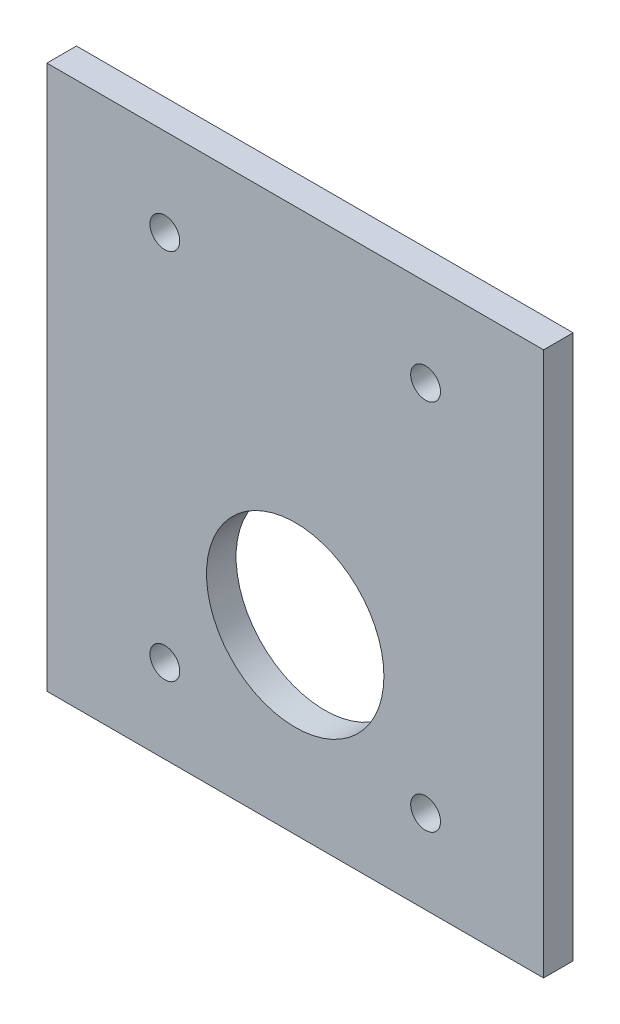
ISO-10303-21;
HEADER;
FILE_DESCRIPTION(('STEP AP214'),'2;1');
FILE_NAME('part.step','',(''),(''),'','','');
FILE_SCHEMA(('AUTOMOTIVE_DESIGN { 1 0 10303 214 1 1 1 1 }'));
ENDSEC;
DATA;
#1=APPLICATION_CONTEXT('core data for automotive mechanical design processes');
#2=APPLICATION_PROTOCOL_DEFINITION('international standard','automotive_design',2000,#1);
#3=PRODUCT_CONTEXT('',#1,'mechanical');
#4=PRODUCT('Part','Part','',(#3));
#5=PRODUCT_RELATED_PRODUCT_CATEGORY('part','',(#4));
#6=PRODUCT_DEFINITION_FORMATION('','',#4);
#7=PRODUCT_DEFINITION_CONTEXT('part definition',#1,'design');
#8=PRODUCT_DEFINITION('design','',#6,#7);
#9=PRODUCT_DEFINITION_SHAPE('','',#8);
#10=(LENGTH_UNIT() NAMED_UNIT(*) SI_UNIT(.MILLI.,.METRE.));
#11=(NAMED_UNIT(*) PLANE_ANGLE_UNIT() SI_UNIT($,.RADIAN.));
#12=(NAMED_UNIT(*) SI_UNIT($,.STERADIAN.) SOLID_ANGLE_UNIT());
#13=UNCERTAINTY_MEASURE_WITH_UNIT(LENGTH_MEASURE(1.E-05),#10,'distance_accuracy_value','');
#14=(GEOMETRIC_REPRESENTATION_CONTEXT(3) GLOBAL_UNCERTAINTY_ASSIGNED_CONTEXT((#13)) GLOBAL_UNIT_ASSIGNED_CONTEXT((#10,
#11,#12)) REPRESENTATION_CONTEXT('',''));
#15=CARTESIAN_POINT('',(0.,0.,0.));
#16=DIRECTION('',(0.,0.,1.));
#17=DIRECTION('',(1.,0.,0.));
#18=AXIS2_PLACEMENT_3D('',#15,#16,#17);
#19=CARTESIAN_POINT('',(0.,0.,3.175));
#20=DIRECTION('',(0.,0.,-1.));
#21=DIRECTION('',(-1.,0.,0.));
#22=AXIS2_PLACEMENT_3D('',#19,#20,#21);
#23=PLANE('',#22);
#24=DIRECTION('',(0.,-1.,0.));
#25=VECTOR('',#24,1.);
#26=CARTESIAN_POINT('',(-26.67,38.92,3.175));
#27=LINE('',#26,#25);
#28=CARTESIAN_POINT('',(-26.67,38.92,3.175));
#29=VERTEX_POINT('',#28);
#30=CARTESIAN_POINT('',(-26.67,-19.5,3.175));
#31=VERTEX_POINT('',#30);
#32=EDGE_CURVE('E89',#29,#31,#27,.T.);
#33=ORIENTED_EDGE('',*,*,#32,.T.);
#34=DIRECTION('',(1.,0.,0.));
#35=VECTOR('',#34,1.);
#36=CARTESIAN_POINT('',(26.67,-19.5,3.175));
#37=LINE('',#36,#35);
#38=CARTESIAN_POINT('',(26.67,-19.5,3.175));
#39=VERTEX_POINT('',#38);
#40=EDGE_CURVE('E84',#31,#39,#37,.T.);
#41=ORIENTED_EDGE('',*,*,#40,.T.);
#42=DIRECTION('',(0.,1.,0.));
#43=VECTOR('',#42,1.);
#44=CARTESIAN_POINT('',(26.67,38.92,3.175));
#45=LINE('',#44,#43);
#46=CARTESIAN_POINT('',(26.67,38.92,3.175));
#47=VERTEX_POINT('',#46);
#48=EDGE_CURVE('E87',#39,#47,#45,.T.);
#49=ORIENTED_EDGE('',*,*,#48,.T.);
#50=DIRECTION('',(-1.,0.,0.));
#51=VECTOR('',#50,1.);
#52=CARTESIAN_POINT('',(26.67,38.92,3.175));
#53=LINE('',#52,#51);
#54=EDGE_CURVE('E54',#47,#29,#53,.T.);
#55=ORIENTED_EDGE('',*,*,#54,.T.);
#56=EDGE_LOOP('',(#33,#41,#49,#55));
#57=FACE_BOUND('',#56,.T.);
#58=CARTESIAN_POINT('',(0.,0.,3.175));
#59=DIRECTION('',(0.,0.,1.));
#60=DIRECTION('',(1.,0.,0.));
#61=AXIS2_PLACEMENT_3D('',#58,#59,#60);
#62=CIRCLE('',#61,9.525);
#63=CARTESIAN_POINT('',(9.525,0.,3.175));
#64=VERTEX_POINT('',#63);
#65=EDGE_CURVE('E104',#64,#64,#62,.T.);
#66=ORIENTED_EDGE('',*,*,#65,.F.);
#67=EDGE_LOOP('',(#66));
#68=FACE_BOUND('',#67,.T.);
#69=CARTESIAN_POINT('',(-14.,29.5,3.175));
#70=DIRECTION('',(0.,0.,1.));
#71=DIRECTION('',(1.,0.,0.));
#72=AXIS2_PLACEMENT_3D('',#69,#70,#71);
#73=CIRCLE('',#72,1.6);
#74=CARTESIAN_POINT('',(-12.4,29.5,3.175));
#75=VERTEX_POINT('',#74);
#76=EDGE_CURVE('E119',#75,#75,#73,.T.);
#77=ORIENTED_EDGE('',*,*,#76,.F.);
#78=EDGE_LOOP('',(#77));
#79=FACE_BOUND('',#78,.T.);
#80=CARTESIAN_POINT('',(14.,29.5,3.175));
#81=DIRECTION('',(0.,0.,1.));
#82=DIRECTION('',(1.,0.,0.));
#83=AXIS2_PLACEMENT_3D('',#80,#81,#82);
#84=CIRCLE('',#83,1.6);
#85=CARTESIAN_POINT('',(15.6,29.5,3.175));
#86=VERTEX_POINT('',#85);
#87=EDGE_CURVE('E125',#86,#86,#84,.T.);
#88=ORIENTED_EDGE('',*,*,#87,.F.);
#89=EDGE_LOOP('',(#88));
#90=FACE_BOUND('',#89,.T.);
#91=CARTESIAN_POINT('',(14.,-10.5,3.175));
#92=DIRECTION('',(0.,0.,1.));
#93=DIRECTION('',(1.,0.,0.));
#94=AXIS2_PLACEMENT_3D('',#91,#92,#93);
#95=CIRCLE('',#94,1.6);
#96=CARTESIAN_POINT('',(15.6,-10.5,3.175));
#97=VERTEX_POINT('',#96);
#98=EDGE_CURVE('E131',#97,#97,#95,.T.);
#99=ORIENTED_EDGE('',*,*,#98,.F.);
#100=EDGE_LOOP('',(#99));
#101=FACE_BOUND('',#100,.T.);
#102=CARTESIAN_POINT('',(-14.,-10.5,3.175));
#103=DIRECTION('',(0.,0.,1.));
#104=DIRECTION('',(1.,0.,0.));
#105=AXIS2_PLACEMENT_3D('',#102,#103,#104);
#106=CIRCLE('',#105,1.6);
#107=CARTESIAN_POINT('',(-12.4,-10.5,3.175));
#108=VERTEX_POINT('',#107);
#109=EDGE_CURVE('E137',#108,#108,#106,.T.);
#110=ORIENTED_EDGE('',*,*,#109,.F.);
#111=EDGE_LOOP('',(#110));
#112=FACE_BOUND('',#111,.T.);
#113=ADVANCED_FACE('F37',(#57,#68,#79,#90,#101,#112),#23,.F.);
#114=CARTESIAN_POINT('',(0.,0.,0.));
#115=DIRECTION('',(0.,0.,-1.));
#116=DIRECTION('',(-1.,0.,0.));
#117=AXIS2_PLACEMENT_3D('',#114,#115,#116);
#118=PLANE('',#117);
#119=CARTESIAN_POINT('',(14.,-10.5,0.));
#120=DIRECTION('',(0.,0.,1.));
#121=DIRECTION('',(1.,0.,0.));
#122=AXIS2_PLACEMENT_3D('',#119,#120,#121);
#123=CIRCLE('',#122,1.6);
#124=CARTESIAN_POINT('',(15.6,-10.5,0.));
#125=VERTEX_POINT('',#124);
#126=EDGE_CURVE('E134',#125,#125,#123,.T.);
#127=ORIENTED_EDGE('',*,*,#126,.T.);
#128=EDGE_LOOP('',(#127));
#129=FACE_BOUND('',#128,.T.);
#130=CARTESIAN_POINT('',(-14.,29.5,0.));
#131=DIRECTION('',(0.,0.,1.));
#132=DIRECTION('',(1.,0.,0.));
#133=AXIS2_PLACEMENT_3D('',#130,#131,#132);
#134=CIRCLE('',#133,1.6);
#135=CARTESIAN_POINT('',(-12.4,29.5,0.));
#136=VERTEX_POINT('',#135);
#137=EDGE_CURVE('E122',#136,#136,#134,.T.);
#138=ORIENTED_EDGE('',*,*,#137,.T.);
#139=EDGE_LOOP('',(#138));
#140=FACE_BOUND('',#139,.T.);
#141=DIRECTION('',(0.,-1.,0.));
#142=VECTOR('',#141,1.);
#143=CARTESIAN_POINT('',(-26.67,38.92,0.));
#144=LINE('',#143,#142);
#145=CARTESIAN_POINT('',(-26.67,38.92,0.));
#146=VERTEX_POINT('',#145);
#147=CARTESIAN_POINT('',(-26.67,-19.5,0.));
#148=VERTEX_POINT('',#147);
#149=EDGE_CURVE('E101',#146,#148,#144,.T.);
#150=ORIENTED_EDGE('',*,*,#149,.F.);
#151=DIRECTION('',(-1.,0.,0.));
#152=VECTOR('',#151,1.);
#153=CARTESIAN_POINT('',(26.67,38.92,0.));
#154=LINE('',#153,#152);
#155=CARTESIAN_POINT('',(26.67,38.92,0.));
#156=VERTEX_POINT('',#155);
#157=EDGE_CURVE('E77',#156,#146,#154,.T.);
#158=ORIENTED_EDGE('',*,*,#157,.F.);
#159=DIRECTION('',(0.,1.,0.));
#160=VECTOR('',#159,1.);
#161=CARTESIAN_POINT('',(26.67,38.92,0.));
#162=LINE('',#161,#160);
#163=CARTESIAN_POINT('',(26.67,-19.5,0.));
#164=VERTEX_POINT('',#163);
#165=EDGE_CURVE('E71',#164,#156,#162,.T.);
#166=ORIENTED_EDGE('',*,*,#165,.F.);
#167=DIRECTION('',(1.,0.,0.));
#168=VECTOR('',#167,1.);
#169=CARTESIAN_POINT('',(26.67,-19.5,0.));
#170=LINE('',#169,#168);
#171=EDGE_CURVE('E93',#148,#164,#170,.T.);
#172=ORIENTED_EDGE('',*,*,#171,.F.);
#173=EDGE_LOOP('',(#150,#158,#166,#172));
#174=FACE_BOUND('',#173,.T.);
#175=CARTESIAN_POINT('',(0.,0.,0.));
#176=DIRECTION('',(0.,0.,1.));
#177=DIRECTION('',(1.,0.,0.));
#178=AXIS2_PLACEMENT_3D('',#175,#176,#177);
#179=CIRCLE('',#178,9.525);
#180=CARTESIAN_POINT('',(9.525,0.,0.));
#181=VERTEX_POINT('',#180);
#182=EDGE_CURVE('E116',#181,#181,#179,.T.);
#183=ORIENTED_EDGE('',*,*,#182,.T.);
#184=EDGE_LOOP('',(#183));
#185=FACE_BOUND('',#184,.T.);
#186=CARTESIAN_POINT('',(14.,29.5,0.));
#187=DIRECTION('',(0.,0.,1.));
#188=DIRECTION('',(1.,0.,0.));
#189=AXIS2_PLACEMENT_3D('',#186,#187,#188);
#190=CIRCLE('',#189,1.6);
#191=CARTESIAN_POINT('',(15.6,29.5,0.));
#192=VERTEX_POINT('',#191);
#193=EDGE_CURVE('E128',#192,#192,#190,.T.);
#194=ORIENTED_EDGE('',*,*,#193,.T.);
#195=EDGE_LOOP('',(#194));
#196=FACE_BOUND('',#195,.T.);
#197=CARTESIAN_POINT('',(-14.,-10.5,0.));
#198=DIRECTION('',(0.,0.,1.));
#199=DIRECTION('',(1.,0.,0.));
#200=AXIS2_PLACEMENT_3D('',#197,#198,#199);
#201=CIRCLE('',#200,1.6);
#202=CARTESIAN_POINT('',(-12.4,-10.5,0.));
#203=VERTEX_POINT('',#202);
#204=EDGE_CURVE('E140',#203,#203,#201,.T.);
#205=ORIENTED_EDGE('',*,*,#204,.T.);
#206=EDGE_LOOP('',(#205));
#207=FACE_BOUND('',#206,.T.);
#208=ADVANCED_FACE('F112',(#129,#140,#174,#185,#196,#207),#118,.T.);
#209=CARTESIAN_POINT('',(-26.67,38.92,3.175));
#210=DIRECTION('',(1.,0.,0.));
#211=DIRECTION('',(0.,1.,0.));
#212=AXIS2_PLACEMENT_3D('',#209,#210,#211);
#213=PLANE('',#212);
#214=ORIENTED_EDGE('',*,*,#149,.T.);
#215=DIRECTION('',(0.,0.,-1.));
#216=VECTOR('',#215,1.);
#217=CARTESIAN_POINT('',(-26.67,-19.5,3.175));
#218=LINE('',#217,#216);
#219=EDGE_CURVE('E11',#31,#148,#218,.T.);
#220=ORIENTED_EDGE('',*,*,#219,.F.);
#221=ORIENTED_EDGE('',*,*,#32,.F.);
#222=DIRECTION('',(0.,0.,-1.));
#223=VECTOR('',#222,1.);
#224=CARTESIAN_POINT('',(-26.67,38.92,3.175));
#225=LINE('',#224,#223);
#226=EDGE_CURVE('E97',#29,#146,#225,.T.);
#227=ORIENTED_EDGE('',*,*,#226,.T.);
#228=EDGE_LOOP('',(#214,#220,#221,#227));
#229=FACE_BOUND('',#228,.T.);
#230=ADVANCED_FACE('F39',(#229),#213,.F.);
#231=CARTESIAN_POINT('',(26.67,-19.5,3.175));
#232=DIRECTION('',(0.,1.,0.));
#233=DIRECTION('',(-1.,0.,0.));
#234=AXIS2_PLACEMENT_3D('',#231,#232,#233);
#235=PLANE('',#234);
#236=ORIENTED_EDGE('',*,*,#171,.T.);
#237=DIRECTION('',(0.,0.,-1.));
#238=VECTOR('',#237,1.);
#239=CARTESIAN_POINT('',(26.67,-19.5,3.175));
#240=LINE('',#239,#238);
#241=EDGE_CURVE('E46',#39,#164,#240,.T.);
#242=ORIENTED_EDGE('',*,*,#241,.F.);
#243=ORIENTED_EDGE('',*,*,#40,.F.);
#244=ORIENTED_EDGE('',*,*,#219,.T.);
#245=EDGE_LOOP('',(#236,#242,#243,#244));
#246=FACE_BOUND('',#245,.T.);
#247=ADVANCED_FACE('F92',(#246),#235,.F.);
#248=CARTESIAN_POINT('',(26.67,38.92,3.175));
#249=DIRECTION('',(-1.,0.,0.));
#250=DIRECTION('',(0.,-1.,0.));
#251=AXIS2_PLACEMENT_3D('',#248,#249,#250);
#252=PLANE('',#251);
#253=ORIENTED_EDGE('',*,*,#165,.T.);
#254=DIRECTION('',(0.,0.,-1.));
#255=VECTOR('',#254,1.);
#256=CARTESIAN_POINT('',(26.67,38.92,3.175));
#257=LINE('',#256,#255);
#258=EDGE_CURVE('E94',#47,#156,#257,.T.);
#259=ORIENTED_EDGE('',*,*,#258,.F.);
#260=ORIENTED_EDGE('',*,*,#48,.F.);
#261=ORIENTED_EDGE('',*,*,#241,.T.);
#262=EDGE_LOOP('',(#253,#259,#260,#261));
#263=FACE_BOUND('',#262,.T.);
#264=ADVANCED_FACE('F95',(#263),#252,.F.);
#265=CARTESIAN_POINT('',(26.67,38.92,3.175));
#266=DIRECTION('',(0.,-1.,0.));
#267=DIRECTION('',(0.,0.,-1.));
#268=AXIS2_PLACEMENT_3D('',#265,#266,#267);
#269=PLANE('',#268);
#270=ORIENTED_EDGE('',*,*,#157,.T.);
#271=ORIENTED_EDGE('',*,*,#226,.F.);
#272=ORIENTED_EDGE('',*,*,#54,.F.);
#273=ORIENTED_EDGE('',*,*,#258,.T.);
#274=EDGE_LOOP('',(#270,#271,#272,#273));
#275=FACE_BOUND('',#274,.T.);
#276=ADVANCED_FACE('F109',(#275),#269,.F.);
#277=CARTESIAN_POINT('',(0.,0.,3.175));
#278=DIRECTION('',(0.,0.,-1.));
#279=DIRECTION('',(-1.,0.,0.));
#280=AXIS2_PLACEMENT_3D('',#277,#278,#279);
#281=CYLINDRICAL_SURFACE('',#280,9.525);
#282=ORIENTED_EDGE('',*,*,#65,.T.);
#283=EDGE_LOOP('',(#282));
#284=FACE_BOUND('',#283,.T.);
#285=ORIENTED_EDGE('',*,*,#182,.F.);
#286=EDGE_LOOP('',(#285));
#287=FACE_BOUND('',#286,.T.);
#288=ADVANCED_FACE('F157',(#284,#287),#281,.F.);
#289=CARTESIAN_POINT('',(-14.,29.5,3.175));
#290=DIRECTION('',(0.,0.,-1.));
#291=DIRECTION('',(-1.,0.,0.));
#292=AXIS2_PLACEMENT_3D('',#289,#290,#291);
#293=CYLINDRICAL_SURFACE('',#292,1.6);
#294=ORIENTED_EDGE('',*,*,#76,.T.);
#295=EDGE_LOOP('',(#294));
#296=FACE_BOUND('',#295,.T.);
#297=ORIENTED_EDGE('',*,*,#137,.F.);
#298=EDGE_LOOP('',(#297));
#299=FACE_BOUND('',#298,.T.);
#300=ADVANCED_FACE('F203',(#296,#299),#293,.F.);
#301=CARTESIAN_POINT('',(14.,29.5,3.175));
#302=DIRECTION('',(0.,0.,-1.));
#303=DIRECTION('',(-1.,0.,0.));
#304=AXIS2_PLACEMENT_3D('',#301,#302,#303);
#305=CYLINDRICAL_SURFACE('',#304,1.6);
#306=ORIENTED_EDGE('',*,*,#87,.T.);
#307=EDGE_LOOP('',(#306));
#308=FACE_BOUND('',#307,.T.);
#309=ORIENTED_EDGE('',*,*,#193,.F.);
#310=EDGE_LOOP('',(#309));
#311=FACE_BOUND('',#310,.T.);
#312=ADVANCED_FACE('F211',(#308,#311),#305,.F.);
#313=CARTESIAN_POINT('',(14.,-10.5,3.175));
#314=DIRECTION('',(0.,0.,-1.));
#315=DIRECTION('',(-1.,0.,0.));
#316=AXIS2_PLACEMENT_3D('',#313,#314,#315);
#317=CYLINDRICAL_SURFACE('',#316,1.6);
#318=ORIENTED_EDGE('',*,*,#98,.T.);
#319=EDGE_LOOP('',(#318));
#320=FACE_BOUND('',#319,.T.);
#321=ORIENTED_EDGE('',*,*,#126,.F.);
#322=EDGE_LOOP('',(#321));
#323=FACE_BOUND('',#322,.T.);
#324=ADVANCED_FACE('F219',(#320,#323),#317,.F.);
#325=CARTESIAN_POINT('',(-14.,-10.5,3.175));
#326=DIRECTION('',(0.,0.,-1.));
#327=DIRECTION('',(-1.,0.,0.));
#328=AXIS2_PLACEMENT_3D('',#325,#326,#327);
#329=CYLINDRICAL_SURFACE('',#328,1.6);
#330=ORIENTED_EDGE('',*,*,#109,.T.);
#331=EDGE_LOOP('',(#330));
#332=FACE_BOUND('',#331,.T.);
#333=ORIENTED_EDGE('',*,*,#204,.F.);
#334=EDGE_LOOP('',(#333));
#335=FACE_BOUND('',#334,.T.);
#336=ADVANCED_FACE('F146',(#332,#335),#329,.F.);
#337=CLOSED_SHELL('',(#113,#208,#230,#247,#264,#276,#288,#300,#312,#324,#336));
#338=MANIFOLD_SOLID_BREP('B2',#337);
#339=ADVANCED_BREP_SHAPE_REPRESENTATION('',(#18,#338),#14);
#340=SHAPE_DEFINITION_REPRESENTATION(#9,#339);
ENDSEC;
END-ISO-10303-21;
